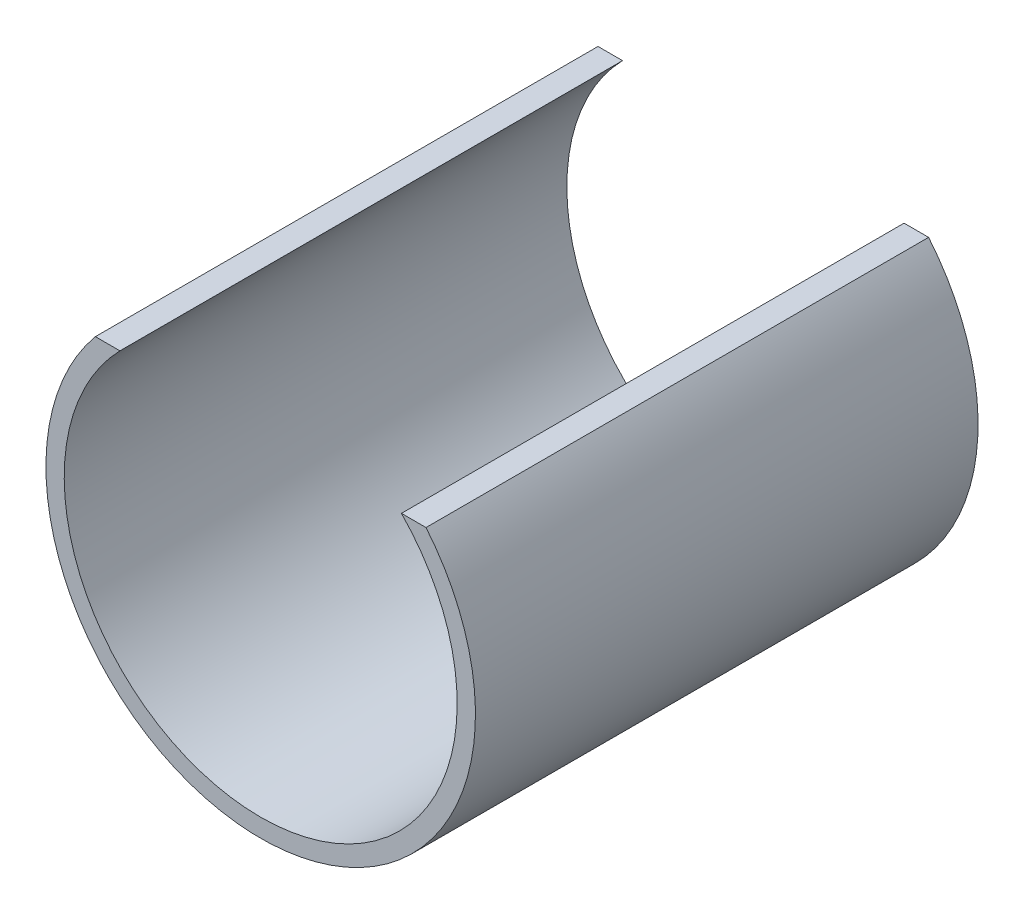
ISO-10303-21;
HEADER;
FILE_DESCRIPTION(('STEP AP214'),'2;1');
FILE_NAME('part.step','',(''),(''),'','','');
FILE_SCHEMA(('AUTOMOTIVE_DESIGN { 1 0 10303 214 1 1 1 1 }'));
ENDSEC;
DATA;
#1=APPLICATION_CONTEXT('core data for automotive mechanical design processes');
#2=APPLICATION_PROTOCOL_DEFINITION('international standard','automotive_design',2000,#1);
#3=PRODUCT_CONTEXT('',#1,'mechanical');
#4=PRODUCT('Part','Part','',(#3));
#5=PRODUCT_RELATED_PRODUCT_CATEGORY('part','',(#4));
#6=PRODUCT_DEFINITION_FORMATION('','',#4);
#7=PRODUCT_DEFINITION_CONTEXT('part definition',#1,'design');
#8=PRODUCT_DEFINITION('design','',#6,#7);
#9=PRODUCT_DEFINITION_SHAPE('','',#8);
#10=(LENGTH_UNIT() NAMED_UNIT(*) SI_UNIT(.MILLI.,.METRE.));
#11=(NAMED_UNIT(*) PLANE_ANGLE_UNIT() SI_UNIT($,.RADIAN.));
#12=(NAMED_UNIT(*) SI_UNIT($,.STERADIAN.) SOLID_ANGLE_UNIT());
#13=UNCERTAINTY_MEASURE_WITH_UNIT(LENGTH_MEASURE(1.E-05),#10,'distance_accuracy_value','');
#14=(GEOMETRIC_REPRESENTATION_CONTEXT(3) GLOBAL_UNCERTAINTY_ASSIGNED_CONTEXT((#13)) GLOBAL_UNIT_ASSIGNED_CONTEXT((#10,
#11,#12)) REPRESENTATION_CONTEXT('',''));
#15=CARTESIAN_POINT('',(0.,0.,0.));
#16=DIRECTION('',(0.,0.,1.));
#17=DIRECTION('',(1.,0.,0.));
#18=AXIS2_PLACEMENT_3D('',#15,#16,#17);
#19=CARTESIAN_POINT('',(0.,0.,-5.5));
#20=DIRECTION('',(0.,0.,-1.));
#21=DIRECTION('',(0.,-1.,0.));
#22=AXIS2_PLACEMENT_3D('',#19,#20,#21);
#23=PLANE('',#22);
#24=DIRECTION('',(-1.,0.,0.));
#25=VECTOR('',#24,1.);
#26=CARTESIAN_POINT('',(0.,1.5,-5.5));
#27=LINE('',#26,#25);
#28=CARTESIAN_POINT('',(-1.54029218007494,1.5,-5.5));
#29=VERTEX_POINT('',#28);
#30=CARTESIAN_POINT('',(-1.80900525151255,1.5,-5.5));
#31=VERTEX_POINT('',#30);
#32=EDGE_CURVE('E53',#29,#31,#27,.T.);
#33=ORIENTED_EDGE('',*,*,#32,.F.);
#34=CARTESIAN_POINT('',(0.,0.,-5.5));
#35=DIRECTION('',(0.,0.,-1.));
#36=DIRECTION('',(-1.,0.,0.));
#37=AXIS2_PLACEMENT_3D('',#34,#35,#36);
#38=CIRCLE('',#37,2.15);
#39=CARTESIAN_POINT('',(1.54029218007494,1.5,-5.5));
#40=VERTEX_POINT('',#39);
#41=EDGE_CURVE('E76',#29,#40,#38,.F.);
#42=ORIENTED_EDGE('',*,*,#41,.T.);
#43=DIRECTION('',(1.,0.,0.));
#44=VECTOR('',#43,1.);
#45=CARTESIAN_POINT('',(0.,1.5,-5.5));
#46=LINE('',#45,#44);
#47=CARTESIAN_POINT('',(1.80900525151255,1.5,-5.5));
#48=VERTEX_POINT('',#47);
#49=EDGE_CURVE('E81',#40,#48,#46,.T.);
#50=ORIENTED_EDGE('',*,*,#49,.T.);
#51=CARTESIAN_POINT('',(0.,0.,-5.5));
#52=DIRECTION('',(0.,0.,-1.));
#53=DIRECTION('',(-1.,0.,0.));
#54=AXIS2_PLACEMENT_3D('',#51,#52,#53);
#55=CIRCLE('',#54,2.35);
#56=EDGE_CURVE('E96',#31,#48,#55,.F.);
#57=ORIENTED_EDGE('',*,*,#56,.F.);
#58=EDGE_LOOP('',(#33,#42,#50,#57));
#59=FACE_BOUND('',#58,.T.);
#60=ADVANCED_FACE('F45',(#59),#23,.T.);
#61=CARTESIAN_POINT('',(0.,0.,0.));
#62=DIRECTION('',(0.,0.,1.));
#63=DIRECTION('',(1.,0.,0.));
#64=AXIS2_PLACEMENT_3D('',#61,#62,#63);
#65=PLANE('',#64);
#66=DIRECTION('',(-1.,0.,0.));
#67=VECTOR('',#66,1.);
#68=CARTESIAN_POINT('',(0.,1.5,0.));
#69=LINE('',#68,#67);
#70=CARTESIAN_POINT('',(-1.54029218007494,1.5,0.));
#71=VERTEX_POINT('',#70);
#72=CARTESIAN_POINT('',(-1.80900525151255,1.5,0.));
#73=VERTEX_POINT('',#72);
#74=EDGE_CURVE('E105',#71,#73,#69,.T.);
#75=ORIENTED_EDGE('',*,*,#74,.T.);
#76=CARTESIAN_POINT('',(0.,0.,0.));
#77=DIRECTION('',(0.,0.,1.));
#78=DIRECTION('',(1.,0.,0.));
#79=AXIS2_PLACEMENT_3D('',#76,#77,#78);
#80=CIRCLE('',#79,2.35);
#81=CARTESIAN_POINT('',(1.80900525151255,1.5,0.));
#82=VERTEX_POINT('',#81);
#83=EDGE_CURVE('E94',#73,#82,#80,.T.);
#84=ORIENTED_EDGE('',*,*,#83,.T.);
#85=DIRECTION('',(1.,0.,0.));
#86=VECTOR('',#85,1.);
#87=CARTESIAN_POINT('',(0.,1.5,0.));
#88=LINE('',#87,#86);
#89=CARTESIAN_POINT('',(1.54029218007494,1.5,0.));
#90=VERTEX_POINT('',#89);
#91=EDGE_CURVE('E98',#90,#82,#88,.T.);
#92=ORIENTED_EDGE('',*,*,#91,.F.);
#93=CARTESIAN_POINT('',(0.,0.,0.));
#94=DIRECTION('',(0.,0.,1.));
#95=DIRECTION('',(1.,0.,0.));
#96=AXIS2_PLACEMENT_3D('',#93,#94,#95);
#97=CIRCLE('',#96,2.15);
#98=EDGE_CURVE('E112',#71,#90,#97,.T.);
#99=ORIENTED_EDGE('',*,*,#98,.F.);
#100=EDGE_LOOP('',(#75,#84,#92,#99));
#101=FACE_BOUND('',#100,.T.);
#102=ADVANCED_FACE('F104',(#101),#65,.T.);
#103=CARTESIAN_POINT('',(0.,0.,-11.5755658172717));
#104=DIRECTION('',(0.,0.,1.));
#105=DIRECTION('',(1.,0.,0.));
#106=AXIS2_PLACEMENT_3D('',#103,#104,#105);
#107=CYLINDRICAL_SURFACE('',#106,2.35);
#108=DIRECTION('',(0.,0.,1.));
#109=VECTOR('',#108,1.);
#110=CARTESIAN_POINT('',(-1.80900525151255,1.5,-11.5755658172717));
#111=LINE('',#110,#109);
#112=EDGE_CURVE('E13',#31,#73,#111,.T.);
#113=ORIENTED_EDGE('',*,*,#112,.F.);
#114=ORIENTED_EDGE('',*,*,#56,.T.);
#115=DIRECTION('',(0.,0.,1.));
#116=VECTOR('',#115,1.);
#117=CARTESIAN_POINT('',(1.80900525151255,1.5,-11.5755658172717));
#118=LINE('',#117,#116);
#119=EDGE_CURVE('E91',#48,#82,#118,.T.);
#120=ORIENTED_EDGE('',*,*,#119,.T.);
#121=ORIENTED_EDGE('',*,*,#83,.F.);
#122=EDGE_LOOP('',(#113,#114,#120,#121));
#123=FACE_BOUND('',#122,.T.);
#124=ADVANCED_FACE('F92',(#123),#107,.T.);
#125=CARTESIAN_POINT('',(0.,1.5,-11.5755658172717));
#126=DIRECTION('',(0.,-1.,0.));
#127=DIRECTION('',(0.,0.,-1.));
#128=AXIS2_PLACEMENT_3D('',#125,#126,#127);
#129=PLANE('',#128);
#130=ORIENTED_EDGE('',*,*,#49,.F.);
#131=DIRECTION('',(0.,0.,1.));
#132=VECTOR('',#131,1.);
#133=CARTESIAN_POINT('',(1.54029218007494,1.5,-11.5755658172717));
#134=LINE('',#133,#132);
#135=EDGE_CURVE('E86',#40,#90,#134,.T.);
#136=ORIENTED_EDGE('',*,*,#135,.T.);
#137=ORIENTED_EDGE('',*,*,#91,.T.);
#138=ORIENTED_EDGE('',*,*,#119,.F.);
#139=EDGE_LOOP('',(#130,#136,#137,#138));
#140=FACE_BOUND('',#139,.T.);
#141=ADVANCED_FACE('F99',(#140),#129,.F.);
#142=CARTESIAN_POINT('',(0.,0.,-11.5755658172717));
#143=DIRECTION('',(0.,0.,1.));
#144=DIRECTION('',(1.,0.,0.));
#145=AXIS2_PLACEMENT_3D('',#142,#143,#144);
#146=CYLINDRICAL_SURFACE('',#145,2.15);
#147=ORIENTED_EDGE('',*,*,#41,.F.);
#148=DIRECTION('',(0.,0.,1.));
#149=VECTOR('',#148,1.);
#150=CARTESIAN_POINT('',(-1.54029218007494,1.5,-11.5755658172717));
#151=LINE('',#150,#149);
#152=EDGE_CURVE('E102',#29,#71,#151,.T.);
#153=ORIENTED_EDGE('',*,*,#152,.T.);
#154=ORIENTED_EDGE('',*,*,#98,.T.);
#155=ORIENTED_EDGE('',*,*,#135,.F.);
#156=EDGE_LOOP('',(#147,#153,#154,#155));
#157=FACE_BOUND('',#156,.T.);
#158=ADVANCED_FACE('F118',(#157),#146,.F.);
#159=CARTESIAN_POINT('',(0.,1.5,-11.5755658172717));
#160=DIRECTION('',(0.,1.,0.));
#161=DIRECTION('',(0.,0.,1.));
#162=AXIS2_PLACEMENT_3D('',#159,#160,#161);
#163=PLANE('',#162);
#164=ORIENTED_EDGE('',*,*,#152,.F.);
#165=ORIENTED_EDGE('',*,*,#32,.T.);
#166=ORIENTED_EDGE('',*,*,#112,.T.);
#167=ORIENTED_EDGE('',*,*,#74,.F.);
#168=EDGE_LOOP('',(#164,#165,#166,#167));
#169=FACE_BOUND('',#168,.T.);
#170=ADVANCED_FACE('F119',(#169),#163,.T.);
#171=CLOSED_SHELL('',(#60,#102,#124,#141,#158,#170));
#172=MANIFOLD_SOLID_BREP('B2',#171);
#173=ADVANCED_BREP_SHAPE_REPRESENTATION('',(#18,#172),#14);
#174=SHAPE_DEFINITION_REPRESENTATION(#9,#173);
ENDSEC;
END-ISO-10303-21;
